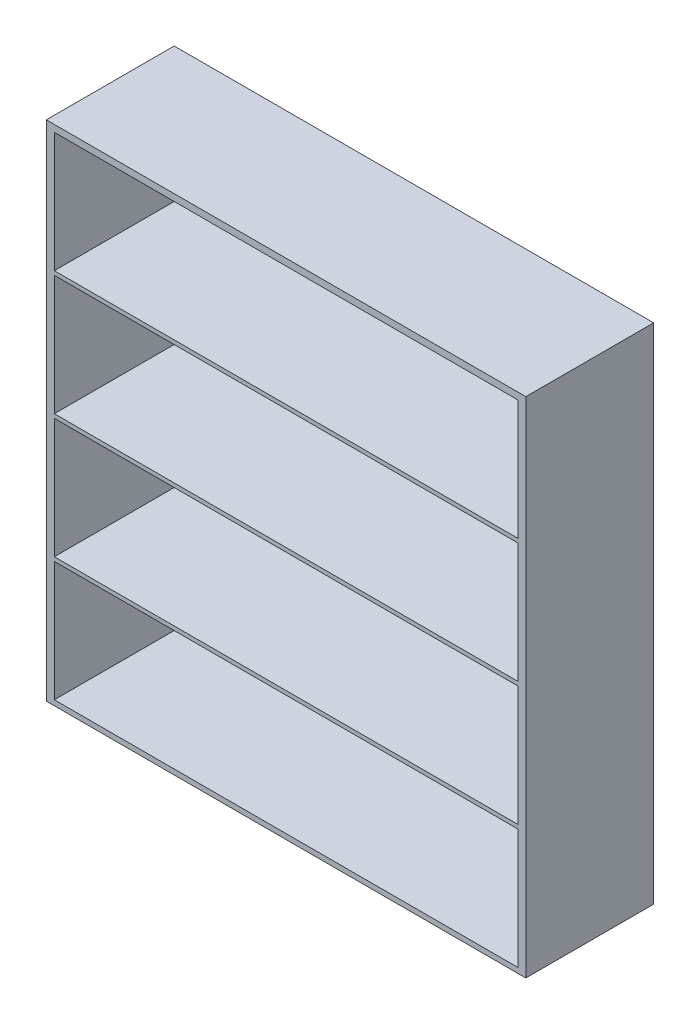
ISO-10303-21;
HEADER;
FILE_DESCRIPTION(('STEP AP214'),'2;1');
FILE_NAME('part.step','',(''),(''),'','','');
FILE_SCHEMA(('AUTOMOTIVE_DESIGN { 1 0 10303 214 1 1 1 1 }'));
ENDSEC;
DATA;
#1=APPLICATION_CONTEXT('core data for automotive mechanical design processes');
#2=APPLICATION_PROTOCOL_DEFINITION('international standard','automotive_design',2000,#1);
#3=PRODUCT_CONTEXT('',#1,'mechanical');
#4=PRODUCT('Part','Part','',(#3));
#5=PRODUCT_RELATED_PRODUCT_CATEGORY('part','',(#4));
#6=PRODUCT_DEFINITION_FORMATION('','',#4);
#7=PRODUCT_DEFINITION_CONTEXT('part definition',#1,'design');
#8=PRODUCT_DEFINITION('design','',#6,#7);
#9=PRODUCT_DEFINITION_SHAPE('','',#8);
#10=(LENGTH_UNIT() NAMED_UNIT(*) SI_UNIT(.MILLI.,.METRE.));
#11=(NAMED_UNIT(*) PLANE_ANGLE_UNIT() SI_UNIT($,.RADIAN.));
#12=(NAMED_UNIT(*) SI_UNIT($,.STERADIAN.) SOLID_ANGLE_UNIT());
#13=UNCERTAINTY_MEASURE_WITH_UNIT(LENGTH_MEASURE(1.E-05),#10,'distance_accuracy_value','');
#14=(GEOMETRIC_REPRESENTATION_CONTEXT(3) GLOBAL_UNCERTAINTY_ASSIGNED_CONTEXT((#13)) GLOBAL_UNIT_ASSIGNED_CONTEXT((#10,
#11,#12)) REPRESENTATION_CONTEXT('',''));
#15=CARTESIAN_POINT('',(0.,0.,0.));
#16=DIRECTION('',(0.,0.,1.));
#17=DIRECTION('',(1.,0.,0.));
#18=AXIS2_PLACEMENT_3D('',#15,#16,#17);
#19=CARTESIAN_POINT('',(0.,0.,16.));
#20=DIRECTION('',(1.,0.,0.));
#21=DIRECTION('',(0.,0.,-1.));
#22=AXIS2_PLACEMENT_3D('',#19,#20,#21);
#23=PLANE('',#22);
#24=DIRECTION('',(0.,-1.,0.));
#25=VECTOR('',#24,1.);
#26=CARTESIAN_POINT('',(0.,0.,0.));
#27=LINE('',#26,#25);
#28=CARTESIAN_POINT('',(0.,63.,0.));
#29=VERTEX_POINT('',#28);
#30=CARTESIAN_POINT('',(0.,0.,0.));
#31=VERTEX_POINT('',#30);
#32=EDGE_CURVE('E295',#29,#31,#27,.T.);
#33=ORIENTED_EDGE('',*,*,#32,.T.);
#34=DIRECTION('',(0.,0.,-1.));
#35=VECTOR('',#34,1.);
#36=CARTESIAN_POINT('',(0.,0.,16.));
#37=LINE('',#36,#35);
#38=CARTESIAN_POINT('',(0.,0.,16.));
#39=VERTEX_POINT('',#38);
#40=EDGE_CURVE('E11',#39,#31,#37,.T.);
#41=ORIENTED_EDGE('',*,*,#40,.F.);
#42=DIRECTION('',(0.,-1.,0.));
#43=VECTOR('',#42,1.);
#44=CARTESIAN_POINT('',(0.,0.,16.));
#45=LINE('',#44,#43);
#46=CARTESIAN_POINT('',(0.,63.,16.));
#47=VERTEX_POINT('',#46);
#48=EDGE_CURVE('E302',#47,#39,#45,.T.);
#49=ORIENTED_EDGE('',*,*,#48,.F.);
#50=DIRECTION('',(0.,0.,-1.));
#51=VECTOR('',#50,1.);
#52=CARTESIAN_POINT('',(0.,63.,16.));
#53=LINE('',#52,#51);
#54=EDGE_CURVE('E312',#47,#29,#53,.T.);
#55=ORIENTED_EDGE('',*,*,#54,.T.);
#56=EDGE_LOOP('',(#33,#41,#49,#55));
#57=FACE_BOUND('',#56,.T.);
#58=ADVANCED_FACE('F33',(#57),#23,.F.);
#59=CARTESIAN_POINT('',(0.,0.,16.));
#60=DIRECTION('',(0.,1.,0.));
#61=DIRECTION('',(0.,0.,1.));
#62=AXIS2_PLACEMENT_3D('',#59,#60,#61);
#63=PLANE('',#62);
#64=DIRECTION('',(1.,0.,0.));
#65=VECTOR('',#64,1.);
#66=CARTESIAN_POINT('',(0.,0.,0.));
#67=LINE('',#66,#65);
#68=CARTESIAN_POINT('',(60.,0.,0.));
#69=VERTEX_POINT('',#68);
#70=EDGE_CURVE('E315',#31,#69,#67,.T.);
#71=ORIENTED_EDGE('',*,*,#70,.T.);
#72=DIRECTION('',(0.,0.,-1.));
#73=VECTOR('',#72,1.);
#74=CARTESIAN_POINT('',(60.,0.,16.));
#75=LINE('',#74,#73);
#76=CARTESIAN_POINT('',(60.,0.,16.));
#77=VERTEX_POINT('',#76);
#78=EDGE_CURVE('E40',#77,#69,#75,.T.);
#79=ORIENTED_EDGE('',*,*,#78,.F.);
#80=DIRECTION('',(1.,0.,0.));
#81=VECTOR('',#80,1.);
#82=CARTESIAN_POINT('',(0.,0.,16.));
#83=LINE('',#82,#81);
#84=EDGE_CURVE('E305',#39,#77,#83,.T.);
#85=ORIENTED_EDGE('',*,*,#84,.F.);
#86=ORIENTED_EDGE('',*,*,#40,.T.);
#87=EDGE_LOOP('',(#71,#79,#85,#86));
#88=FACE_BOUND('',#87,.T.);
#89=ADVANCED_FACE('F345',(#88),#63,.F.);
#90=CARTESIAN_POINT('',(60.,0.,16.));
#91=DIRECTION('',(-1.,0.,0.));
#92=DIRECTION('',(0.,0.,1.));
#93=AXIS2_PLACEMENT_3D('',#90,#91,#92);
#94=PLANE('',#93);
#95=DIRECTION('',(0.,1.,0.));
#96=VECTOR('',#95,1.);
#97=CARTESIAN_POINT('',(60.,0.,0.));
#98=LINE('',#97,#96);
#99=CARTESIAN_POINT('',(60.,63.,0.));
#100=VERTEX_POINT('',#99);
#101=EDGE_CURVE('E317',#69,#100,#98,.T.);
#102=ORIENTED_EDGE('',*,*,#101,.T.);
#103=DIRECTION('',(0.,0.,-1.));
#104=VECTOR('',#103,1.);
#105=CARTESIAN_POINT('',(60.,63.,16.));
#106=LINE('',#105,#104);
#107=CARTESIAN_POINT('',(60.,63.,16.));
#108=VERTEX_POINT('',#107);
#109=EDGE_CURVE('E322',#108,#100,#106,.T.);
#110=ORIENTED_EDGE('',*,*,#109,.F.);
#111=DIRECTION('',(0.,1.,0.));
#112=VECTOR('',#111,1.);
#113=CARTESIAN_POINT('',(60.,0.,16.));
#114=LINE('',#113,#112);
#115=EDGE_CURVE('E308',#77,#108,#114,.T.);
#116=ORIENTED_EDGE('',*,*,#115,.F.);
#117=ORIENTED_EDGE('',*,*,#78,.T.);
#118=EDGE_LOOP('',(#102,#110,#116,#117));
#119=FACE_BOUND('',#118,.T.);
#120=ADVANCED_FACE('F329',(#119),#94,.F.);
#121=CARTESIAN_POINT('',(0.,63.,16.));
#122=DIRECTION('',(0.,-1.,0.));
#123=DIRECTION('',(0.,0.,-1.));
#124=AXIS2_PLACEMENT_3D('',#121,#122,#123);
#125=PLANE('',#124);
#126=DIRECTION('',(-1.,0.,0.));
#127=VECTOR('',#126,1.);
#128=CARTESIAN_POINT('',(0.,63.,0.));
#129=LINE('',#128,#127);
#130=EDGE_CURVE('E306',#100,#29,#129,.T.);
#131=ORIENTED_EDGE('',*,*,#130,.T.);
#132=ORIENTED_EDGE('',*,*,#54,.F.);
#133=DIRECTION('',(-1.,0.,0.));
#134=VECTOR('',#133,1.);
#135=CARTESIAN_POINT('',(0.,63.,16.));
#136=LINE('',#135,#134);
#137=EDGE_CURVE('E310',#108,#47,#136,.T.);
#138=ORIENTED_EDGE('',*,*,#137,.F.);
#139=ORIENTED_EDGE('',*,*,#109,.T.);
#140=EDGE_LOOP('',(#131,#132,#138,#139));
#141=FACE_BOUND('',#140,.T.);
#142=ADVANCED_FACE('F338',(#141),#125,.F.);
#143=CARTESIAN_POINT('',(0.,0.,16.));
#144=DIRECTION('',(0.,0.,-1.));
#145=DIRECTION('',(-1.,0.,0.));
#146=AXIS2_PLACEMENT_3D('',#143,#144,#145);
#147=PLANE('',#146);
#148=DIRECTION('',(1.,0.,0.));
#149=VECTOR('',#148,1.);
#150=CARTESIAN_POINT('',(0.999999999999839,47.15,16.));
#151=LINE('',#150,#149);
#152=CARTESIAN_POINT('',(0.999999999999839,47.15,16.));
#153=VERTEX_POINT('',#152);
#154=CARTESIAN_POINT('',(58.9999999999998,47.15,16.));
#155=VERTEX_POINT('',#154);
#156=EDGE_CURVE('E198',#153,#155,#151,.T.);
#157=ORIENTED_EDGE('',*,*,#156,.F.);
#158=DIRECTION('',(0.,-1.,0.));
#159=VECTOR('',#158,1.);
#160=CARTESIAN_POINT('',(0.999999999999838,62.15,16.));
#161=LINE('',#160,#159);
#162=CARTESIAN_POINT('',(0.999999999999838,62.15,16.));
#163=VERTEX_POINT('',#162);
#164=EDGE_CURVE('E47',#163,#153,#161,.T.);
#165=ORIENTED_EDGE('',*,*,#164,.F.);
#166=DIRECTION('',(-1.,0.,0.));
#167=VECTOR('',#166,1.);
#168=CARTESIAN_POINT('',(0.999999999999838,62.15,16.));
#169=LINE('',#168,#167);
#170=CARTESIAN_POINT('',(58.9999999999998,62.15,16.));
#171=VERTEX_POINT('',#170);
#172=EDGE_CURVE('E189',#171,#163,#169,.T.);
#173=ORIENTED_EDGE('',*,*,#172,.F.);
#174=DIRECTION('',(0.,1.,0.));
#175=VECTOR('',#174,1.);
#176=CARTESIAN_POINT('',(58.9999999999998,62.15,16.));
#177=LINE('',#176,#175);
#178=EDGE_CURVE('E192',#155,#171,#177,.T.);
#179=ORIENTED_EDGE('',*,*,#178,.F.);
#180=EDGE_LOOP('',(#157,#165,#173,#179));
#181=FACE_BOUND('',#180,.T.);
#182=DIRECTION('',(1.,0.,0.));
#183=VECTOR('',#182,1.);
#184=CARTESIAN_POINT('',(0.999999999999894,31.65,16.));
#185=LINE('',#184,#183);
#186=CARTESIAN_POINT('',(0.999999999999894,31.65,16.));
#187=VERTEX_POINT('',#186);
#188=CARTESIAN_POINT('',(58.9999999999999,31.65,16.));
#189=VERTEX_POINT('',#188);
#190=EDGE_CURVE('E222',#187,#189,#185,.T.);
#191=ORIENTED_EDGE('',*,*,#190,.F.);
#192=DIRECTION('',(0.,-1.,0.));
#193=VECTOR('',#192,1.);
#194=CARTESIAN_POINT('',(0.999999999999892,46.65,16.));
#195=LINE('',#194,#193);
#196=CARTESIAN_POINT('',(0.999999999999892,46.65,16.));
#197=VERTEX_POINT('',#196);
#198=EDGE_CURVE('E55',#197,#187,#195,.T.);
#199=ORIENTED_EDGE('',*,*,#198,.F.);
#200=DIRECTION('',(-1.,0.,0.));
#201=VECTOR('',#200,1.);
#202=CARTESIAN_POINT('',(0.999999999999892,46.65,16.));
#203=LINE('',#202,#201);
#204=CARTESIAN_POINT('',(58.9999999999999,46.65,16.));
#205=VERTEX_POINT('',#204);
#206=EDGE_CURVE('E211',#205,#197,#203,.T.);
#207=ORIENTED_EDGE('',*,*,#206,.F.);
#208=DIRECTION('',(0.,1.,0.));
#209=VECTOR('',#208,1.);
#210=CARTESIAN_POINT('',(58.9999999999999,46.65,16.));
#211=LINE('',#210,#209);
#212=EDGE_CURVE('E225',#189,#205,#211,.T.);
#213=ORIENTED_EDGE('',*,*,#212,.F.);
#214=EDGE_LOOP('',(#191,#199,#207,#213));
#215=FACE_BOUND('',#214,.T.);
#216=DIRECTION('',(1.,0.,0.));
#217=VECTOR('',#216,1.);
#218=CARTESIAN_POINT('',(0.999999999999948,16.15,16.));
#219=LINE('',#218,#217);
#220=CARTESIAN_POINT('',(0.999999999999948,16.15,16.));
#221=VERTEX_POINT('',#220);
#222=CARTESIAN_POINT('',(58.9999999999999,16.15,16.));
#223=VERTEX_POINT('',#222);
#224=EDGE_CURVE('E253',#221,#223,#219,.T.);
#225=ORIENTED_EDGE('',*,*,#224,.F.);
#226=DIRECTION('',(0.,-1.,0.));
#227=VECTOR('',#226,1.);
#228=CARTESIAN_POINT('',(0.999999999999946,31.15,16.));
#229=LINE('',#228,#227);
#230=CARTESIAN_POINT('',(0.999999999999946,31.15,16.));
#231=VERTEX_POINT('',#230);
#232=EDGE_CURVE('E232',#231,#221,#229,.T.);
#233=ORIENTED_EDGE('',*,*,#232,.F.);
#234=DIRECTION('',(-1.,0.,0.));
#235=VECTOR('',#234,1.);
#236=CARTESIAN_POINT('',(0.999999999999946,31.15,16.));
#237=LINE('',#236,#235);
#238=CARTESIAN_POINT('',(58.9999999999999,31.15,16.));
#239=VERTEX_POINT('',#238);
#240=EDGE_CURVE('E242',#239,#231,#237,.T.);
#241=ORIENTED_EDGE('',*,*,#240,.F.);
#242=DIRECTION('',(0.,1.,0.));
#243=VECTOR('',#242,1.);
#244=CARTESIAN_POINT('',(58.9999999999999,31.15,16.));
#245=LINE('',#244,#243);
#246=EDGE_CURVE('E256',#223,#239,#245,.T.);
#247=ORIENTED_EDGE('',*,*,#246,.F.);
#248=EDGE_LOOP('',(#225,#233,#241,#247));
#249=FACE_BOUND('',#248,.T.);
#250=DIRECTION('',(1.,0.,0.));
#251=VECTOR('',#250,1.);
#252=CARTESIAN_POINT('',(1.,0.65,16.));
#253=LINE('',#252,#251);
#254=CARTESIAN_POINT('',(1.,0.65,16.));
#255=VERTEX_POINT('',#254);
#256=CARTESIAN_POINT('',(59.,0.65,16.));
#257=VERTEX_POINT('',#256);
#258=EDGE_CURVE('E285',#255,#257,#253,.T.);
#259=ORIENTED_EDGE('',*,*,#258,.F.);
#260=DIRECTION('',(0.,-1.,0.));
#261=VECTOR('',#260,1.);
#262=CARTESIAN_POINT('',(1.,15.65,16.));
#263=LINE('',#262,#261);
#264=CARTESIAN_POINT('',(1.,15.65,16.));
#265=VERTEX_POINT('',#264);
#266=EDGE_CURVE('E263',#265,#255,#263,.T.);
#267=ORIENTED_EDGE('',*,*,#266,.F.);
#268=DIRECTION('',(-1.,0.,0.));
#269=VECTOR('',#268,1.);
#270=CARTESIAN_POINT('',(1.,15.65,16.));
#271=LINE('',#270,#269);
#272=CARTESIAN_POINT('',(59.,15.65,16.));
#273=VERTEX_POINT('',#272);
#274=EDGE_CURVE('E274',#273,#265,#271,.T.);
#275=ORIENTED_EDGE('',*,*,#274,.F.);
#276=DIRECTION('',(0.,1.,0.));
#277=VECTOR('',#276,1.);
#278=CARTESIAN_POINT('',(59.,15.65,16.));
#279=LINE('',#278,#277);
#280=EDGE_CURVE('E288',#257,#273,#279,.T.);
#281=ORIENTED_EDGE('',*,*,#280,.F.);
#282=EDGE_LOOP('',(#259,#267,#275,#281));
#283=FACE_BOUND('',#282,.T.);
#284=ORIENTED_EDGE('',*,*,#48,.T.);
#285=ORIENTED_EDGE('',*,*,#84,.T.);
#286=ORIENTED_EDGE('',*,*,#115,.T.);
#287=ORIENTED_EDGE('',*,*,#137,.T.);
#288=EDGE_LOOP('',(#284,#285,#286,#287));
#289=FACE_BOUND('',#288,.T.);
#290=ADVANCED_FACE('F344',(#181,#215,#249,#283,#289),#147,.F.);
#291=CARTESIAN_POINT('',(0.,0.,0.));
#292=DIRECTION('',(0.,0.,-1.));
#293=DIRECTION('',(-1.,0.,0.));
#294=AXIS2_PLACEMENT_3D('',#291,#292,#293);
#295=PLANE('',#294);
#296=ORIENTED_EDGE('',*,*,#32,.F.);
#297=ORIENTED_EDGE('',*,*,#130,.F.);
#298=ORIENTED_EDGE('',*,*,#101,.F.);
#299=ORIENTED_EDGE('',*,*,#70,.F.);
#300=EDGE_LOOP('',(#296,#297,#298,#299));
#301=FACE_BOUND('',#300,.T.);
#302=ADVANCED_FACE('F335',(#301),#295,.T.);
#303=CARTESIAN_POINT('',(1.,15.65,1.));
#304=DIRECTION('',(-1.,0.,0.));
#305=DIRECTION('',(0.,-1.,0.));
#306=AXIS2_PLACEMENT_3D('',#303,#304,#305);
#307=PLANE('',#306);
#308=ORIENTED_EDGE('',*,*,#266,.T.);
#309=DIRECTION('',(0.,0.,1.));
#310=VECTOR('',#309,1.);
#311=CARTESIAN_POINT('',(1.,0.65,1.));
#312=LINE('',#311,#310);
#313=CARTESIAN_POINT('',(1.,0.65,1.));
#314=VERTEX_POINT('',#313);
#315=EDGE_CURVE('E283',#314,#255,#312,.T.);
#316=ORIENTED_EDGE('',*,*,#315,.F.);
#317=DIRECTION('',(0.,-1.,0.));
#318=VECTOR('',#317,1.);
#319=CARTESIAN_POINT('',(1.,15.65,1.));
#320=LINE('',#319,#318);
#321=CARTESIAN_POINT('',(1.,15.65,1.));
#322=VERTEX_POINT('',#321);
#323=EDGE_CURVE('E270',#322,#314,#320,.T.);
#324=ORIENTED_EDGE('',*,*,#323,.F.);
#325=DIRECTION('',(0.,0.,1.));
#326=VECTOR('',#325,1.);
#327=CARTESIAN_POINT('',(1.,15.65,1.));
#328=LINE('',#327,#326);
#329=EDGE_CURVE('E293',#322,#265,#328,.T.);
#330=ORIENTED_EDGE('',*,*,#329,.T.);
#331=EDGE_LOOP('',(#308,#316,#324,#330));
#332=FACE_BOUND('',#331,.T.);
#333=ADVANCED_FACE('F357',(#332),#307,.F.);
#334=CARTESIAN_POINT('',(1.,15.65,1.));
#335=DIRECTION('',(0.,1.,0.));
#336=DIRECTION('',(0.,0.,1.));
#337=AXIS2_PLACEMENT_3D('',#334,#335,#336);
#338=PLANE('',#337);
#339=ORIENTED_EDGE('',*,*,#274,.T.);
#340=ORIENTED_EDGE('',*,*,#329,.F.);
#341=DIRECTION('',(-1.,0.,0.));
#342=VECTOR('',#341,1.);
#343=CARTESIAN_POINT('',(1.,15.65,1.));
#344=LINE('',#343,#342);
#345=CARTESIAN_POINT('',(59.,15.65,1.));
#346=VERTEX_POINT('',#345);
#347=EDGE_CURVE('E280',#346,#322,#344,.T.);
#348=ORIENTED_EDGE('',*,*,#347,.F.);
#349=DIRECTION('',(0.,0.,1.));
#350=VECTOR('',#349,1.);
#351=CARTESIAN_POINT('',(59.,15.65,1.));
#352=LINE('',#351,#350);
#353=EDGE_CURVE('E296',#346,#273,#352,.T.);
#354=ORIENTED_EDGE('',*,*,#353,.T.);
#355=EDGE_LOOP('',(#339,#340,#348,#354));
#356=FACE_BOUND('',#355,.T.);
#357=ADVANCED_FACE('F363',(#356),#338,.F.);
#358=CARTESIAN_POINT('',(59.,15.65,1.));
#359=DIRECTION('',(1.,0.,0.));
#360=DIRECTION('',(0.,0.,-1.));
#361=AXIS2_PLACEMENT_3D('',#358,#359,#360);
#362=PLANE('',#361);
#363=ORIENTED_EDGE('',*,*,#280,.T.);
#364=ORIENTED_EDGE('',*,*,#353,.F.);
#365=DIRECTION('',(0.,1.,0.));
#366=VECTOR('',#365,1.);
#367=CARTESIAN_POINT('',(59.,15.65,1.));
#368=LINE('',#367,#366);
#369=CARTESIAN_POINT('',(59.,0.65,1.));
#370=VERTEX_POINT('',#369);
#371=EDGE_CURVE('E277',#370,#346,#368,.T.);
#372=ORIENTED_EDGE('',*,*,#371,.F.);
#373=DIRECTION('',(0.,0.,1.));
#374=VECTOR('',#373,1.);
#375=CARTESIAN_POINT('',(59.,0.65,1.));
#376=LINE('',#375,#374);
#377=EDGE_CURVE('E298',#370,#257,#376,.T.);
#378=ORIENTED_EDGE('',*,*,#377,.T.);
#379=EDGE_LOOP('',(#363,#364,#372,#378));
#380=FACE_BOUND('',#379,.T.);
#381=ADVANCED_FACE('F369',(#380),#362,.F.);
#382=CARTESIAN_POINT('',(1.,0.65,1.));
#383=DIRECTION('',(0.,-1.,0.));
#384=DIRECTION('',(0.,0.,-1.));
#385=AXIS2_PLACEMENT_3D('',#382,#383,#384);
#386=PLANE('',#385);
#387=ORIENTED_EDGE('',*,*,#258,.T.);
#388=ORIENTED_EDGE('',*,*,#377,.F.);
#389=DIRECTION('',(1.,0.,0.));
#390=VECTOR('',#389,1.);
#391=CARTESIAN_POINT('',(1.,0.65,1.));
#392=LINE('',#391,#390);
#393=EDGE_CURVE('E273',#314,#370,#392,.T.);
#394=ORIENTED_EDGE('',*,*,#393,.F.);
#395=ORIENTED_EDGE('',*,*,#315,.T.);
#396=EDGE_LOOP('',(#387,#388,#394,#395));
#397=FACE_BOUND('',#396,.T.);
#398=ADVANCED_FACE('F365',(#397),#386,.F.);
#399=CARTESIAN_POINT('',(0.,0.,1.));
#400=DIRECTION('',(0.,0.,1.));
#401=DIRECTION('',(1.,0.,0.));
#402=AXIS2_PLACEMENT_3D('',#399,#400,#401);
#403=PLANE('',#402);
#404=ORIENTED_EDGE('',*,*,#323,.T.);
#405=ORIENTED_EDGE('',*,*,#393,.T.);
#406=ORIENTED_EDGE('',*,*,#371,.T.);
#407=ORIENTED_EDGE('',*,*,#347,.T.);
#408=EDGE_LOOP('',(#404,#405,#406,#407));
#409=FACE_BOUND('',#408,.T.);
#410=ADVANCED_FACE('F368',(#409),#403,.T.);
#411=CARTESIAN_POINT('',(0.999999999999946,31.15,1.));
#412=DIRECTION('',(-1.,0.,0.));
#413=DIRECTION('',(0.,-1.,0.));
#414=AXIS2_PLACEMENT_3D('',#411,#412,#413);
#415=PLANE('',#414);
#416=ORIENTED_EDGE('',*,*,#232,.T.);
#417=DIRECTION('',(0.,0.,1.));
#418=VECTOR('',#417,1.);
#419=CARTESIAN_POINT('',(0.999999999999948,16.15,1.));
#420=LINE('',#419,#418);
#421=CARTESIAN_POINT('',(0.999999999999948,16.15,1.));
#422=VERTEX_POINT('',#421);
#423=EDGE_CURVE('E251',#422,#221,#420,.T.);
#424=ORIENTED_EDGE('',*,*,#423,.F.);
#425=DIRECTION('',(0.,-1.,0.));
#426=VECTOR('',#425,1.);
#427=CARTESIAN_POINT('',(0.999999999999946,31.15,1.));
#428=LINE('',#427,#426);
#429=CARTESIAN_POINT('',(0.999999999999946,31.15,1.));
#430=VERTEX_POINT('',#429);
#431=EDGE_CURVE('E238',#430,#422,#428,.T.);
#432=ORIENTED_EDGE('',*,*,#431,.F.);
#433=DIRECTION('',(0.,0.,1.));
#434=VECTOR('',#433,1.);
#435=CARTESIAN_POINT('',(0.999999999999946,31.15,1.));
#436=LINE('',#435,#434);
#437=EDGE_CURVE('E261',#430,#231,#436,.T.);
#438=ORIENTED_EDGE('',*,*,#437,.T.);
#439=EDGE_LOOP('',(#416,#424,#432,#438));
#440=FACE_BOUND('',#439,.T.);
#441=ADVANCED_FACE('F379',(#440),#415,.F.);
#442=CARTESIAN_POINT('',(0.999999999999946,31.15,1.));
#443=DIRECTION('',(0.,1.,0.));
#444=DIRECTION('',(0.,0.,1.));
#445=AXIS2_PLACEMENT_3D('',#442,#443,#444);
#446=PLANE('',#445);
#447=ORIENTED_EDGE('',*,*,#240,.T.);
#448=ORIENTED_EDGE('',*,*,#437,.F.);
#449=DIRECTION('',(-1.,0.,0.));
#450=VECTOR('',#449,1.);
#451=CARTESIAN_POINT('',(0.999999999999946,31.15,1.));
#452=LINE('',#451,#450);
#453=CARTESIAN_POINT('',(58.9999999999999,31.15,1.));
#454=VERTEX_POINT('',#453);
#455=EDGE_CURVE('E248',#454,#430,#452,.T.);
#456=ORIENTED_EDGE('',*,*,#455,.F.);
#457=DIRECTION('',(0.,0.,1.));
#458=VECTOR('',#457,1.);
#459=CARTESIAN_POINT('',(58.9999999999999,31.15,1.));
#460=LINE('',#459,#458);
#461=EDGE_CURVE('E264',#454,#239,#460,.T.);
#462=ORIENTED_EDGE('',*,*,#461,.T.);
#463=EDGE_LOOP('',(#447,#448,#456,#462));
#464=FACE_BOUND('',#463,.T.);
#465=ADVANCED_FACE('F383',(#464),#446,.F.);
#466=CARTESIAN_POINT('',(58.9999999999999,31.15,1.));
#467=DIRECTION('',(1.,0.,0.));
#468=DIRECTION('',(0.,0.,-1.));
#469=AXIS2_PLACEMENT_3D('',#466,#467,#468);
#470=PLANE('',#469);
#471=ORIENTED_EDGE('',*,*,#246,.T.);
#472=ORIENTED_EDGE('',*,*,#461,.F.);
#473=DIRECTION('',(0.,1.,0.));
#474=VECTOR('',#473,1.);
#475=CARTESIAN_POINT('',(58.9999999999999,31.15,1.));
#476=LINE('',#475,#474);
#477=CARTESIAN_POINT('',(58.9999999999999,16.15,1.));
#478=VERTEX_POINT('',#477);
#479=EDGE_CURVE('E245',#478,#454,#476,.T.);
#480=ORIENTED_EDGE('',*,*,#479,.F.);
#481=DIRECTION('',(0.,0.,1.));
#482=VECTOR('',#481,1.);
#483=CARTESIAN_POINT('',(58.9999999999999,16.15,1.));
#484=LINE('',#483,#482);
#485=EDGE_CURVE('E266',#478,#223,#484,.T.);
#486=ORIENTED_EDGE('',*,*,#485,.T.);
#487=EDGE_LOOP('',(#471,#472,#480,#486));
#488=FACE_BOUND('',#487,.T.);
#489=ADVANCED_FACE('F389',(#488),#470,.F.);
#490=CARTESIAN_POINT('',(0.999999999999948,16.15,1.));
#491=DIRECTION('',(0.,-1.,0.));
#492=DIRECTION('',(0.,0.,-1.));
#493=AXIS2_PLACEMENT_3D('',#490,#491,#492);
#494=PLANE('',#493);
#495=ORIENTED_EDGE('',*,*,#224,.T.);
#496=ORIENTED_EDGE('',*,*,#485,.F.);
#497=DIRECTION('',(1.,0.,0.));
#498=VECTOR('',#497,1.);
#499=CARTESIAN_POINT('',(0.999999999999948,16.15,1.));
#500=LINE('',#499,#498);
#501=EDGE_CURVE('E241',#422,#478,#500,.T.);
#502=ORIENTED_EDGE('',*,*,#501,.F.);
#503=ORIENTED_EDGE('',*,*,#423,.T.);
#504=EDGE_LOOP('',(#495,#496,#502,#503));
#505=FACE_BOUND('',#504,.T.);
#506=ADVANCED_FACE('F385',(#505),#494,.F.);
#507=CARTESIAN_POINT('',(0.,0.,1.));
#508=DIRECTION('',(0.,0.,1.));
#509=DIRECTION('',(1.,0.,0.));
#510=AXIS2_PLACEMENT_3D('',#507,#508,#509);
#511=PLANE('',#510);
#512=ORIENTED_EDGE('',*,*,#431,.T.);
#513=ORIENTED_EDGE('',*,*,#501,.T.);
#514=ORIENTED_EDGE('',*,*,#479,.T.);
#515=ORIENTED_EDGE('',*,*,#455,.T.);
#516=EDGE_LOOP('',(#512,#513,#514,#515));
#517=FACE_BOUND('',#516,.T.);
#518=ADVANCED_FACE('F388',(#517),#511,.T.);
#519=CARTESIAN_POINT('',(0.999999999999892,46.65,1.));
#520=DIRECTION('',(-1.,0.,0.));
#521=DIRECTION('',(0.,-1.,0.));
#522=AXIS2_PLACEMENT_3D('',#519,#520,#521);
#523=PLANE('',#522);
#524=ORIENTED_EDGE('',*,*,#198,.T.);
#525=DIRECTION('',(0.,0.,1.));
#526=VECTOR('',#525,1.);
#527=CARTESIAN_POINT('',(0.999999999999894,31.65,1.));
#528=LINE('',#527,#526);
#529=CARTESIAN_POINT('',(0.999999999999894,31.65,1.));
#530=VERTEX_POINT('',#529);
#531=EDGE_CURVE('E220',#530,#187,#528,.T.);
#532=ORIENTED_EDGE('',*,*,#531,.F.);
#533=DIRECTION('',(0.,-1.,0.));
#534=VECTOR('',#533,1.);
#535=CARTESIAN_POINT('',(0.999999999999892,46.65,1.));
#536=LINE('',#535,#534);
#537=CARTESIAN_POINT('',(0.999999999999892,46.65,1.));
#538=VERTEX_POINT('',#537);
#539=EDGE_CURVE('E207',#538,#530,#536,.T.);
#540=ORIENTED_EDGE('',*,*,#539,.F.);
#541=DIRECTION('',(0.,0.,1.));
#542=VECTOR('',#541,1.);
#543=CARTESIAN_POINT('',(0.999999999999892,46.65,1.));
#544=LINE('',#543,#542);
#545=EDGE_CURVE('E230',#538,#197,#544,.T.);
#546=ORIENTED_EDGE('',*,*,#545,.T.);
#547=EDGE_LOOP('',(#524,#532,#540,#546));
#548=FACE_BOUND('',#547,.T.);
#549=ADVANCED_FACE('F399',(#548),#523,.F.);
#550=CARTESIAN_POINT('',(0.999999999999892,46.65,1.));
#551=DIRECTION('',(0.,1.,0.));
#552=DIRECTION('',(0.,0.,1.));
#553=AXIS2_PLACEMENT_3D('',#550,#551,#552);
#554=PLANE('',#553);
#555=ORIENTED_EDGE('',*,*,#206,.T.);
#556=ORIENTED_EDGE('',*,*,#545,.F.);
#557=DIRECTION('',(-1.,0.,0.));
#558=VECTOR('',#557,1.);
#559=CARTESIAN_POINT('',(0.999999999999892,46.65,1.));
#560=LINE('',#559,#558);
#561=CARTESIAN_POINT('',(58.9999999999999,46.65,1.));
#562=VERTEX_POINT('',#561);
#563=EDGE_CURVE('E217',#562,#538,#560,.T.);
#564=ORIENTED_EDGE('',*,*,#563,.F.);
#565=DIRECTION('',(0.,0.,1.));
#566=VECTOR('',#565,1.);
#567=CARTESIAN_POINT('',(58.9999999999999,46.65,1.));
#568=LINE('',#567,#566);
#569=EDGE_CURVE('E233',#562,#205,#568,.T.);
#570=ORIENTED_EDGE('',*,*,#569,.T.);
#571=EDGE_LOOP('',(#555,#556,#564,#570));
#572=FACE_BOUND('',#571,.T.);
#573=ADVANCED_FACE('F403',(#572),#554,.F.);
#574=CARTESIAN_POINT('',(58.9999999999999,46.65,1.));
#575=DIRECTION('',(1.,0.,0.));
#576=DIRECTION('',(0.,0.,-1.));
#577=AXIS2_PLACEMENT_3D('',#574,#575,#576);
#578=PLANE('',#577);
#579=ORIENTED_EDGE('',*,*,#212,.T.);
#580=ORIENTED_EDGE('',*,*,#569,.F.);
#581=DIRECTION('',(0.,1.,0.));
#582=VECTOR('',#581,1.);
#583=CARTESIAN_POINT('',(58.9999999999999,46.65,1.));
#584=LINE('',#583,#582);
#585=CARTESIAN_POINT('',(58.9999999999999,31.65,1.));
#586=VERTEX_POINT('',#585);
#587=EDGE_CURVE('E214',#586,#562,#584,.T.);
#588=ORIENTED_EDGE('',*,*,#587,.F.);
#589=DIRECTION('',(0.,0.,1.));
#590=VECTOR('',#589,1.);
#591=CARTESIAN_POINT('',(58.9999999999999,31.65,1.));
#592=LINE('',#591,#590);
#593=EDGE_CURVE('E235',#586,#189,#592,.T.);
#594=ORIENTED_EDGE('',*,*,#593,.T.);
#595=EDGE_LOOP('',(#579,#580,#588,#594));
#596=FACE_BOUND('',#595,.T.);
#597=ADVANCED_FACE('F408',(#596),#578,.F.);
#598=CARTESIAN_POINT('',(0.999999999999894,31.65,1.));
#599=DIRECTION('',(0.,-1.,0.));
#600=DIRECTION('',(0.,0.,-1.));
#601=AXIS2_PLACEMENT_3D('',#598,#599,#600);
#602=PLANE('',#601);
#603=ORIENTED_EDGE('',*,*,#190,.T.);
#604=ORIENTED_EDGE('',*,*,#593,.F.);
#605=DIRECTION('',(1.,0.,0.));
#606=VECTOR('',#605,1.);
#607=CARTESIAN_POINT('',(0.999999999999894,31.65,1.));
#608=LINE('',#607,#606);
#609=EDGE_CURVE('E210',#530,#586,#608,.T.);
#610=ORIENTED_EDGE('',*,*,#609,.F.);
#611=ORIENTED_EDGE('',*,*,#531,.T.);
#612=EDGE_LOOP('',(#603,#604,#610,#611));
#613=FACE_BOUND('',#612,.T.);
#614=ADVANCED_FACE('F404',(#613),#602,.F.);
#615=CARTESIAN_POINT('',(0.,0.,1.));
#616=DIRECTION('',(0.,0.,1.));
#617=DIRECTION('',(1.,0.,0.));
#618=AXIS2_PLACEMENT_3D('',#615,#616,#617);
#619=PLANE('',#618);
#620=ORIENTED_EDGE('',*,*,#539,.T.);
#621=ORIENTED_EDGE('',*,*,#609,.T.);
#622=ORIENTED_EDGE('',*,*,#587,.T.);
#623=ORIENTED_EDGE('',*,*,#563,.T.);
#624=EDGE_LOOP('',(#620,#621,#622,#623));
#625=FACE_BOUND('',#624,.T.);
#626=ADVANCED_FACE('F407',(#625),#619,.T.);
#627=CARTESIAN_POINT('',(0.999999999999838,62.15,1.));
#628=DIRECTION('',(-1.,0.,0.));
#629=DIRECTION('',(0.,-1.,0.));
#630=AXIS2_PLACEMENT_3D('',#627,#628,#629);
#631=PLANE('',#630);
#632=ORIENTED_EDGE('',*,*,#164,.T.);
#633=DIRECTION('',(0.,0.,1.));
#634=VECTOR('',#633,1.);
#635=CARTESIAN_POINT('',(0.999999999999839,47.15,1.));
#636=LINE('',#635,#634);
#637=CARTESIAN_POINT('',(0.999999999999839,47.15,1.));
#638=VERTEX_POINT('',#637);
#639=EDGE_CURVE('E167',#638,#153,#636,.T.);
#640=ORIENTED_EDGE('',*,*,#639,.F.);
#641=DIRECTION('',(0.,-1.,0.));
#642=VECTOR('',#641,1.);
#643=CARTESIAN_POINT('',(0.999999999999838,62.15,1.));
#644=LINE('',#643,#642);
#645=CARTESIAN_POINT('',(0.999999999999838,62.15,1.));
#646=VERTEX_POINT('',#645);
#647=EDGE_CURVE('E171',#646,#638,#644,.T.);
#648=ORIENTED_EDGE('',*,*,#647,.F.);
#649=DIRECTION('',(0.,0.,1.));
#650=VECTOR('',#649,1.);
#651=CARTESIAN_POINT('',(0.999999999999838,62.15,1.));
#652=LINE('',#651,#650);
#653=EDGE_CURVE('E202',#646,#163,#652,.T.);
#654=ORIENTED_EDGE('',*,*,#653,.T.);
#655=EDGE_LOOP('',(#632,#640,#648,#654));
#656=FACE_BOUND('',#655,.T.);
#657=ADVANCED_FACE('F169',(#656),#631,.F.);
#658=CARTESIAN_POINT('',(0.999999999999838,62.15,1.));
#659=DIRECTION('',(0.,1.,0.));
#660=DIRECTION('',(0.,0.,1.));
#661=AXIS2_PLACEMENT_3D('',#658,#659,#660);
#662=PLANE('',#661);
#663=ORIENTED_EDGE('',*,*,#172,.T.);
#664=ORIENTED_EDGE('',*,*,#653,.F.);
#665=DIRECTION('',(-1.,0.,0.));
#666=VECTOR('',#665,1.);
#667=CARTESIAN_POINT('',(0.999999999999838,62.15,1.));
#668=LINE('',#667,#666);
#669=CARTESIAN_POINT('',(58.9999999999998,62.15,1.));
#670=VERTEX_POINT('',#669);
#671=EDGE_CURVE('E177',#670,#646,#668,.T.);
#672=ORIENTED_EDGE('',*,*,#671,.F.);
#673=DIRECTION('',(0.,0.,1.));
#674=VECTOR('',#673,1.);
#675=CARTESIAN_POINT('',(58.9999999999998,62.15,1.));
#676=LINE('',#675,#674);
#677=EDGE_CURVE('E204',#670,#171,#676,.T.);
#678=ORIENTED_EDGE('',*,*,#677,.T.);
#679=EDGE_LOOP('',(#663,#664,#672,#678));
#680=FACE_BOUND('',#679,.T.);
#681=ADVANCED_FACE('F421',(#680),#662,.F.);
#682=CARTESIAN_POINT('',(58.9999999999998,62.15,1.));
#683=DIRECTION('',(1.,0.,0.));
#684=DIRECTION('',(0.,0.,-1.));
#685=AXIS2_PLACEMENT_3D('',#682,#683,#684);
#686=PLANE('',#685);
#687=ORIENTED_EDGE('',*,*,#178,.T.);
#688=ORIENTED_EDGE('',*,*,#677,.F.);
#689=DIRECTION('',(0.,1.,0.));
#690=VECTOR('',#689,1.);
#691=CARTESIAN_POINT('',(58.9999999999998,62.15,1.));
#692=LINE('',#691,#690);
#693=CARTESIAN_POINT('',(58.9999999999998,47.15,1.));
#694=VERTEX_POINT('',#693);
#695=EDGE_CURVE('E185',#694,#670,#692,.T.);
#696=ORIENTED_EDGE('',*,*,#695,.F.);
#697=DIRECTION('',(0.,0.,1.));
#698=VECTOR('',#697,1.);
#699=CARTESIAN_POINT('',(58.9999999999998,47.15,1.));
#700=LINE('',#699,#698);
#701=EDGE_CURVE('E176',#694,#155,#700,.T.);
#702=ORIENTED_EDGE('',*,*,#701,.T.);
#703=EDGE_LOOP('',(#687,#688,#696,#702));
#704=FACE_BOUND('',#703,.T.);
#705=ADVANCED_FACE('F424',(#704),#686,.F.);
#706=CARTESIAN_POINT('',(0.999999999999839,47.15,1.));
#707=DIRECTION('',(0.,-1.,0.));
#708=DIRECTION('',(0.,0.,-1.));
#709=AXIS2_PLACEMENT_3D('',#706,#707,#708);
#710=PLANE('',#709);
#711=ORIENTED_EDGE('',*,*,#156,.T.);
#712=ORIENTED_EDGE('',*,*,#701,.F.);
#713=DIRECTION('',(1.,0.,0.));
#714=VECTOR('',#713,1.);
#715=CARTESIAN_POINT('',(0.999999999999839,47.15,1.));
#716=LINE('',#715,#714);
#717=EDGE_CURVE('E180',#638,#694,#716,.T.);
#718=ORIENTED_EDGE('',*,*,#717,.F.);
#719=ORIENTED_EDGE('',*,*,#639,.T.);
#720=EDGE_LOOP('',(#711,#712,#718,#719));
#721=FACE_BOUND('',#720,.T.);
#722=ADVANCED_FACE('F181',(#721),#710,.F.);
#723=CARTESIAN_POINT('',(0.,0.,1.));
#724=DIRECTION('',(0.,0.,1.));
#725=DIRECTION('',(1.,0.,0.));
#726=AXIS2_PLACEMENT_3D('',#723,#724,#725);
#727=PLANE('',#726);
#728=ORIENTED_EDGE('',*,*,#647,.T.);
#729=ORIENTED_EDGE('',*,*,#717,.T.);
#730=ORIENTED_EDGE('',*,*,#695,.T.);
#731=ORIENTED_EDGE('',*,*,#671,.T.);
#732=EDGE_LOOP('',(#728,#729,#730,#731));
#733=FACE_BOUND('',#732,.T.);
#734=ADVANCED_FACE('F187',(#733),#727,.T.);
#735=CLOSED_SHELL('',(#58,#89,#120,#142,#290,#302,#333,#357,#381,#398,#410,#441,#465,#489,#506,
#518,#549,#573,#597,#614,#626,#657,#681,#705,#722,#734));
#736=MANIFOLD_SOLID_BREP('B2',#735);
#737=ADVANCED_BREP_SHAPE_REPRESENTATION('',(#18,#736),#14);
#738=SHAPE_DEFINITION_REPRESENTATION(#9,#737);
ENDSEC;
END-ISO-10303-21;
